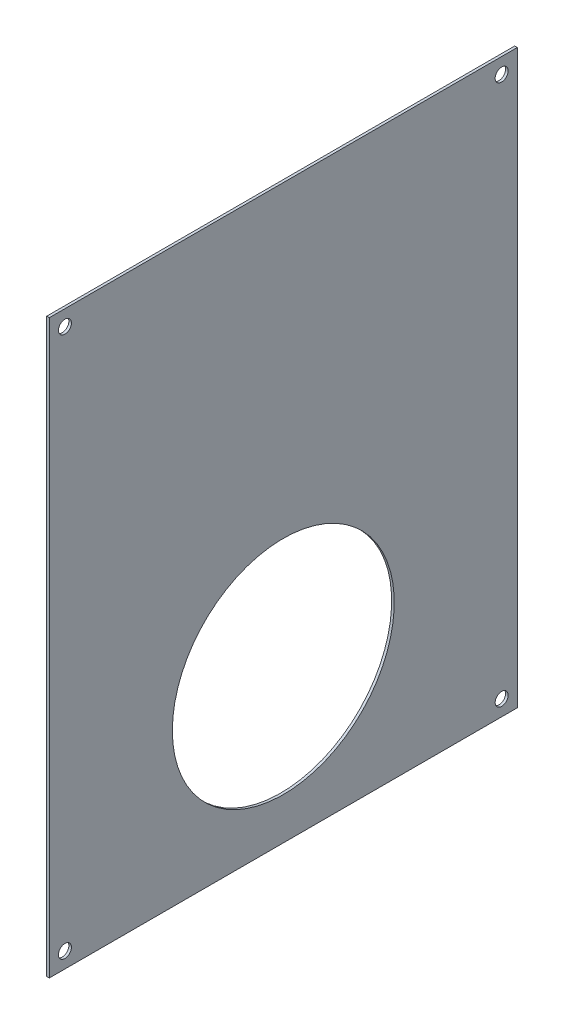
ISO-10303-21;
HEADER;
FILE_DESCRIPTION(('STEP AP214'),'2;1');
FILE_NAME('part.step','',(''),(''),'','','');
FILE_SCHEMA(('AUTOMOTIVE_DESIGN { 1 0 10303 214 1 1 1 1 }'));
ENDSEC;
DATA;
#1=APPLICATION_CONTEXT('core data for automotive mechanical design processes');
#2=APPLICATION_PROTOCOL_DEFINITION('international standard','automotive_design',2000,#1);
#3=PRODUCT_CONTEXT('',#1,'mechanical');
#4=PRODUCT('Part','Part','',(#3));
#5=PRODUCT_RELATED_PRODUCT_CATEGORY('part','',(#4));
#6=PRODUCT_DEFINITION_FORMATION('','',#4);
#7=PRODUCT_DEFINITION_CONTEXT('part definition',#1,'design');
#8=PRODUCT_DEFINITION('design','',#6,#7);
#9=PRODUCT_DEFINITION_SHAPE('','',#8);
#10=(LENGTH_UNIT() NAMED_UNIT(*) SI_UNIT(.MILLI.,.METRE.));
#11=(NAMED_UNIT(*) PLANE_ANGLE_UNIT() SI_UNIT($,.RADIAN.));
#12=(NAMED_UNIT(*) SI_UNIT($,.STERADIAN.) SOLID_ANGLE_UNIT());
#13=UNCERTAINTY_MEASURE_WITH_UNIT(LENGTH_MEASURE(1.E-05),#10,'distance_accuracy_value','');
#14=(GEOMETRIC_REPRESENTATION_CONTEXT(3) GLOBAL_UNCERTAINTY_ASSIGNED_CONTEXT((#13)) GLOBAL_UNIT_ASSIGNED_CONTEXT((#10,
#11,#12)) REPRESENTATION_CONTEXT('',''));
#15=CARTESIAN_POINT('',(0.,0.,0.));
#16=DIRECTION('',(0.,0.,1.));
#17=DIRECTION('',(1.,0.,0.));
#18=AXIS2_PLACEMENT_3D('',#15,#16,#17);
#19=CARTESIAN_POINT('',(0.,0.,0.));
#20=DIRECTION('',(1.,0.,0.));
#21=DIRECTION('',(0.,1.,0.));
#22=AXIS2_PLACEMENT_3D('',#19,#20,#21);
#23=PLANE('',#22);
#24=CARTESIAN_POINT('',(0.,-51.2198971425055,0.));
#25=DIRECTION('',(1.,0.,0.));
#26=DIRECTION('',(0.,0.,-1.));
#27=AXIS2_PLACEMENT_3D('',#24,#25,#26);
#28=CIRCLE('',#27,42.6818250884157);
#29=CARTESIAN_POINT('',(0.,-51.2198971425055,42.6818250884157));
#30=VERTEX_POINT('',#29);
#31=EDGE_CURVE('E124',#30,#30,#28,.T.);
#32=ORIENTED_EDGE('',*,*,#31,.T.);
#33=EDGE_LOOP('',(#32));
#34=FACE_BOUND('',#33,.T.);
#35=CARTESIAN_POINT('',(0.,-104.,84.));
#36=DIRECTION('',(1.,0.,0.));
#37=DIRECTION('',(0.,0.,-1.));
#38=AXIS2_PLACEMENT_3D('',#35,#36,#37);
#39=CIRCLE('',#38,2.5);
#40=CARTESIAN_POINT('',(0.,-104.,86.5));
#41=VERTEX_POINT('',#40);
#42=EDGE_CURVE('E145',#41,#41,#39,.T.);
#43=ORIENTED_EDGE('',*,*,#42,.T.);
#44=EDGE_LOOP('',(#43));
#45=FACE_BOUND('',#44,.T.);
#46=CARTESIAN_POINT('',(0.,104.,-84.));
#47=DIRECTION('',(1.,0.,0.));
#48=DIRECTION('',(0.,0.,-1.));
#49=AXIS2_PLACEMENT_3D('',#46,#47,#48);
#50=CIRCLE('',#49,2.5);
#51=CARTESIAN_POINT('',(0.,104.,-81.5));
#52=VERTEX_POINT('',#51);
#53=EDGE_CURVE('E129',#52,#52,#50,.T.);
#54=ORIENTED_EDGE('',*,*,#53,.T.);
#55=EDGE_LOOP('',(#54));
#56=FACE_BOUND('',#55,.T.);
#57=CARTESIAN_POINT('',(0.,104.,84.));
#58=DIRECTION('',(1.,0.,0.));
#59=DIRECTION('',(0.,0.,-1.));
#60=AXIS2_PLACEMENT_3D('',#57,#58,#59);
#61=CIRCLE('',#60,2.5);
#62=CARTESIAN_POINT('',(0.,104.,86.5));
#63=VERTEX_POINT('',#62);
#64=EDGE_CURVE('E160',#63,#63,#61,.T.);
#65=ORIENTED_EDGE('',*,*,#64,.T.);
#66=EDGE_LOOP('',(#65));
#67=FACE_BOUND('',#66,.T.);
#68=CARTESIAN_POINT('',(0.,-104.,-84.));
#69=DIRECTION('',(1.,0.,0.));
#70=DIRECTION('',(0.,0.,-1.));
#71=AXIS2_PLACEMENT_3D('',#68,#69,#70);
#72=CIRCLE('',#71,2.5);
#73=CARTESIAN_POINT('',(0.,-104.,-81.5));
#74=VERTEX_POINT('',#73);
#75=EDGE_CURVE('E98',#74,#74,#72,.T.);
#76=ORIENTED_EDGE('',*,*,#75,.T.);
#77=EDGE_LOOP('',(#76));
#78=FACE_BOUND('',#77,.T.);
#79=DIRECTION('',(0.,0.,1.));
#80=VECTOR('',#79,1.);
#81=CARTESIAN_POINT('',(0.,110.,-90.));
#82=LINE('',#81,#80);
#83=CARTESIAN_POINT('',(0.,110.,-90.));
#84=VERTEX_POINT('',#83);
#85=CARTESIAN_POINT('',(0.,110.,90.));
#86=VERTEX_POINT('',#85);
#87=EDGE_CURVE('E26',#84,#86,#82,.T.);
#88=ORIENTED_EDGE('',*,*,#87,.F.);
#89=DIRECTION('',(0.,1.,0.));
#90=VECTOR('',#89,1.);
#91=CARTESIAN_POINT('',(0.,-110.,-90.));
#92=LINE('',#91,#90);
#93=CARTESIAN_POINT('',(0.,-110.,-90.));
#94=VERTEX_POINT('',#93);
#95=EDGE_CURVE('E119',#94,#84,#92,.T.);
#96=ORIENTED_EDGE('',*,*,#95,.F.);
#97=DIRECTION('',(0.,0.,-1.));
#98=VECTOR('',#97,1.);
#99=CARTESIAN_POINT('',(0.,-110.,90.));
#100=LINE('',#99,#98);
#101=CARTESIAN_POINT('',(0.,-110.,90.));
#102=VERTEX_POINT('',#101);
#103=EDGE_CURVE('E152',#102,#94,#100,.T.);
#104=ORIENTED_EDGE('',*,*,#103,.F.);
#105=DIRECTION('',(0.,-1.,0.));
#106=VECTOR('',#105,1.);
#107=CARTESIAN_POINT('',(0.,110.,90.));
#108=LINE('',#107,#106);
#109=EDGE_CURVE('E115',#86,#102,#108,.T.);
#110=ORIENTED_EDGE('',*,*,#109,.F.);
#111=EDGE_LOOP('',(#88,#96,#104,#110));
#112=FACE_BOUND('',#111,.T.);
#113=ADVANCED_FACE('F15',(#34,#45,#56,#67,#78,#112),#23,.F.);
#114=CARTESIAN_POINT('',(1.,0.,0.));
#115=DIRECTION('',(1.,0.,0.));
#116=DIRECTION('',(0.,1.,0.));
#117=AXIS2_PLACEMENT_3D('',#114,#115,#116);
#118=PLANE('',#117);
#119=CARTESIAN_POINT('',(1.,-51.2198971425055,0.));
#120=DIRECTION('',(-1.,0.,0.));
#121=DIRECTION('',(0.,0.,-1.));
#122=AXIS2_PLACEMENT_3D('',#119,#120,#121);
#123=CIRCLE('',#122,42.6818250884157);
#124=CARTESIAN_POINT('',(1.,-51.2198971425055,42.6818250884157));
#125=VERTEX_POINT('',#124);
#126=EDGE_CURVE('E148',#125,#125,#123,.T.);
#127=ORIENTED_EDGE('',*,*,#126,.T.);
#128=EDGE_LOOP('',(#127));
#129=FACE_BOUND('',#128,.T.);
#130=CARTESIAN_POINT('',(1.,-104.,84.));
#131=DIRECTION('',(-1.,0.,0.));
#132=DIRECTION('',(0.,0.,-1.));
#133=AXIS2_PLACEMENT_3D('',#130,#131,#132);
#134=CIRCLE('',#133,2.5);
#135=CARTESIAN_POINT('',(1.,-104.,86.5));
#136=VERTEX_POINT('',#135);
#137=EDGE_CURVE('E125',#136,#136,#134,.T.);
#138=ORIENTED_EDGE('',*,*,#137,.T.);
#139=EDGE_LOOP('',(#138));
#140=FACE_BOUND('',#139,.T.);
#141=CARTESIAN_POINT('',(1.,104.,-84.));
#142=DIRECTION('',(-1.,0.,0.));
#143=DIRECTION('',(0.,0.,-1.));
#144=AXIS2_PLACEMENT_3D('',#141,#142,#143);
#145=CIRCLE('',#144,2.5);
#146=CARTESIAN_POINT('',(1.,104.,-81.5));
#147=VERTEX_POINT('',#146);
#148=EDGE_CURVE('E144',#147,#147,#145,.T.);
#149=ORIENTED_EDGE('',*,*,#148,.T.);
#150=EDGE_LOOP('',(#149));
#151=FACE_BOUND('',#150,.T.);
#152=CARTESIAN_POINT('',(1.,104.,84.));
#153=DIRECTION('',(-1.,0.,0.));
#154=DIRECTION('',(0.,0.,-1.));
#155=AXIS2_PLACEMENT_3D('',#152,#153,#154);
#156=CIRCLE('',#155,2.5);
#157=CARTESIAN_POINT('',(1.,104.,86.5));
#158=VERTEX_POINT('',#157);
#159=EDGE_CURVE('E114',#158,#158,#156,.T.);
#160=ORIENTED_EDGE('',*,*,#159,.T.);
#161=EDGE_LOOP('',(#160));
#162=FACE_BOUND('',#161,.T.);
#163=CARTESIAN_POINT('',(1.,-104.,-84.));
#164=DIRECTION('',(-1.,0.,0.));
#165=DIRECTION('',(0.,0.,-1.));
#166=AXIS2_PLACEMENT_3D('',#163,#164,#165);
#167=CIRCLE('',#166,2.5);
#168=CARTESIAN_POINT('',(1.,-104.,-81.5));
#169=VERTEX_POINT('',#168);
#170=EDGE_CURVE('E97',#169,#169,#167,.T.);
#171=ORIENTED_EDGE('',*,*,#170,.T.);
#172=EDGE_LOOP('',(#171));
#173=FACE_BOUND('',#172,.T.);
#174=DIRECTION('',(0.,0.,1.));
#175=VECTOR('',#174,1.);
#176=CARTESIAN_POINT('',(1.,110.,-90.));
#177=LINE('',#176,#175);
#178=CARTESIAN_POINT('',(1.,110.,-90.));
#179=VERTEX_POINT('',#178);
#180=CARTESIAN_POINT('',(1.,110.,90.));
#181=VERTEX_POINT('',#180);
#182=EDGE_CURVE('E9',#179,#181,#177,.T.);
#183=ORIENTED_EDGE('',*,*,#182,.T.);
#184=DIRECTION('',(0.,-1.,0.));
#185=VECTOR('',#184,1.);
#186=CARTESIAN_POINT('',(1.,110.,90.));
#187=LINE('',#186,#185);
#188=CARTESIAN_POINT('',(1.,-110.,90.));
#189=VERTEX_POINT('',#188);
#190=EDGE_CURVE('E118',#181,#189,#187,.T.);
#191=ORIENTED_EDGE('',*,*,#190,.T.);
#192=DIRECTION('',(0.,0.,-1.));
#193=VECTOR('',#192,1.);
#194=CARTESIAN_POINT('',(1.,-110.,90.));
#195=LINE('',#194,#193);
#196=CARTESIAN_POINT('',(1.,-110.,-90.));
#197=VERTEX_POINT('',#196);
#198=EDGE_CURVE('E163',#189,#197,#195,.T.);
#199=ORIENTED_EDGE('',*,*,#198,.T.);
#200=DIRECTION('',(0.,1.,0.));
#201=VECTOR('',#200,1.);
#202=CARTESIAN_POINT('',(1.,-110.,-90.));
#203=LINE('',#202,#201);
#204=EDGE_CURVE('E130',#197,#179,#203,.T.);
#205=ORIENTED_EDGE('',*,*,#204,.T.);
#206=EDGE_LOOP('',(#183,#191,#199,#205));
#207=FACE_BOUND('',#206,.T.);
#208=ADVANCED_FACE('F102',(#129,#140,#151,#162,#173,#207),#118,.T.);
#209=CARTESIAN_POINT('',(0.,110.,-90.));
#210=DIRECTION('',(0.,1.,0.));
#211=DIRECTION('',(1.,0.,0.));
#212=AXIS2_PLACEMENT_3D('',#209,#210,#211);
#213=PLANE('',#212);
#214=ORIENTED_EDGE('',*,*,#87,.T.);
#215=DIRECTION('',(1.,0.,0.));
#216=VECTOR('',#215,1.);
#217=CARTESIAN_POINT('',(0.,110.,90.));
#218=LINE('',#217,#216);
#219=EDGE_CURVE('E155',#86,#181,#218,.T.);
#220=ORIENTED_EDGE('',*,*,#219,.T.);
#221=ORIENTED_EDGE('',*,*,#182,.F.);
#222=DIRECTION('',(1.,0.,0.));
#223=VECTOR('',#222,1.);
#224=CARTESIAN_POINT('',(0.,110.,-90.));
#225=LINE('',#224,#223);
#226=EDGE_CURVE('E123',#84,#179,#225,.T.);
#227=ORIENTED_EDGE('',*,*,#226,.F.);
#228=EDGE_LOOP('',(#214,#220,#221,#227));
#229=FACE_BOUND('',#228,.T.);
#230=ADVANCED_FACE('F198',(#229),#213,.T.);
#231=CARTESIAN_POINT('',(0.,110.,90.));
#232=DIRECTION('',(0.,0.,1.));
#233=DIRECTION('',(1.,0.,0.));
#234=AXIS2_PLACEMENT_3D('',#231,#232,#233);
#235=PLANE('',#234);
#236=ORIENTED_EDGE('',*,*,#109,.T.);
#237=DIRECTION('',(1.,0.,0.));
#238=VECTOR('',#237,1.);
#239=CARTESIAN_POINT('',(0.,-110.,90.));
#240=LINE('',#239,#238);
#241=EDGE_CURVE('E19',#102,#189,#240,.T.);
#242=ORIENTED_EDGE('',*,*,#241,.T.);
#243=ORIENTED_EDGE('',*,*,#190,.F.);
#244=ORIENTED_EDGE('',*,*,#219,.F.);
#245=EDGE_LOOP('',(#236,#242,#243,#244));
#246=FACE_BOUND('',#245,.T.);
#247=ADVANCED_FACE('F204',(#246),#235,.T.);
#248=CARTESIAN_POINT('',(0.,-110.,90.));
#249=DIRECTION('',(0.,-1.,0.));
#250=DIRECTION('',(0.,0.,-1.));
#251=AXIS2_PLACEMENT_3D('',#248,#249,#250);
#252=PLANE('',#251);
#253=ORIENTED_EDGE('',*,*,#103,.T.);
#254=DIRECTION('',(1.,0.,0.));
#255=VECTOR('',#254,1.);
#256=CARTESIAN_POINT('',(0.,-110.,-90.));
#257=LINE('',#256,#255);
#258=EDGE_CURVE('E133',#94,#197,#257,.T.);
#259=ORIENTED_EDGE('',*,*,#258,.T.);
#260=ORIENTED_EDGE('',*,*,#198,.F.);
#261=ORIENTED_EDGE('',*,*,#241,.F.);
#262=EDGE_LOOP('',(#253,#259,#260,#261));
#263=FACE_BOUND('',#262,.T.);
#264=ADVANCED_FACE('F210',(#263),#252,.T.);
#265=CARTESIAN_POINT('',(0.,-110.,-90.));
#266=DIRECTION('',(0.,0.,-1.));
#267=DIRECTION('',(0.,-1.,0.));
#268=AXIS2_PLACEMENT_3D('',#265,#266,#267);
#269=PLANE('',#268);
#270=ORIENTED_EDGE('',*,*,#95,.T.);
#271=ORIENTED_EDGE('',*,*,#226,.T.);
#272=ORIENTED_EDGE('',*,*,#204,.F.);
#273=ORIENTED_EDGE('',*,*,#258,.F.);
#274=EDGE_LOOP('',(#270,#271,#272,#273));
#275=FACE_BOUND('',#274,.T.);
#276=ADVANCED_FACE('F17',(#275),#269,.T.);
#277=CARTESIAN_POINT('',(1.,-51.2198971425055,0.));
#278=DIRECTION('',(-1.,0.,0.));
#279=DIRECTION('',(0.,0.,-1.));
#280=AXIS2_PLACEMENT_3D('',#277,#278,#279);
#281=CYLINDRICAL_SURFACE('',#280,42.6818250884157);
#282=ORIENTED_EDGE('',*,*,#126,.F.);
#283=DIRECTION('',(-1.,0.,0.));
#284=VECTOR('',#283,1.);
#285=CARTESIAN_POINT('',(1.,-51.2198971425055,42.6818250884157));
#286=LINE('',#285,#284);
#287=EDGE_CURVE('E137',#125,#30,#286,.T.);
#288=ORIENTED_EDGE('',*,*,#287,.T.);
#289=ORIENTED_EDGE('',*,*,#31,.F.);
#290=ORIENTED_EDGE('',*,*,#287,.F.);
#291=EDGE_LOOP('',(#282,#288,#289,#290));
#292=FACE_BOUND('',#291,.T.);
#293=ADVANCED_FACE('F236',(#292),#281,.F.);
#294=CARTESIAN_POINT('',(-283.255167059457,-104.,84.));
#295=DIRECTION('',(1.,0.,0.));
#296=DIRECTION('',(0.,0.,-1.));
#297=AXIS2_PLACEMENT_3D('',#294,#295,#296);
#298=CYLINDRICAL_SURFACE('',#297,2.5);
#299=ORIENTED_EDGE('',*,*,#137,.F.);
#300=DIRECTION('',(-1.,0.,0.));
#301=VECTOR('',#300,1.);
#302=CARTESIAN_POINT('',(-283.255167059457,-104.,86.5));
#303=LINE('',#302,#301);
#304=EDGE_CURVE('E110',#136,#41,#303,.T.);
#305=ORIENTED_EDGE('',*,*,#304,.T.);
#306=ORIENTED_EDGE('',*,*,#42,.F.);
#307=ORIENTED_EDGE('',*,*,#304,.F.);
#308=EDGE_LOOP('',(#299,#305,#306,#307));
#309=FACE_BOUND('',#308,.T.);
#310=ADVANCED_FACE('F297',(#309),#298,.F.);
#311=CARTESIAN_POINT('',(-283.255167059457,104.,-84.));
#312=DIRECTION('',(1.,0.,0.));
#313=DIRECTION('',(0.,0.,-1.));
#314=AXIS2_PLACEMENT_3D('',#311,#312,#313);
#315=CYLINDRICAL_SURFACE('',#314,2.5);
#316=ORIENTED_EDGE('',*,*,#148,.F.);
#317=DIRECTION('',(-1.,0.,0.));
#318=VECTOR('',#317,1.);
#319=CARTESIAN_POINT('',(-283.255167059457,104.,-81.5));
#320=LINE('',#319,#318);
#321=EDGE_CURVE('E139',#147,#52,#320,.T.);
#322=ORIENTED_EDGE('',*,*,#321,.T.);
#323=ORIENTED_EDGE('',*,*,#53,.F.);
#324=ORIENTED_EDGE('',*,*,#321,.F.);
#325=EDGE_LOOP('',(#316,#322,#323,#324));
#326=FACE_BOUND('',#325,.T.);
#327=ADVANCED_FACE('F267',(#326),#315,.F.);
#328=CARTESIAN_POINT('',(-283.255167059457,104.,84.));
#329=DIRECTION('',(1.,0.,0.));
#330=DIRECTION('',(0.,0.,-1.));
#331=AXIS2_PLACEMENT_3D('',#328,#329,#330);
#332=CYLINDRICAL_SURFACE('',#331,2.5);
#333=ORIENTED_EDGE('',*,*,#159,.F.);
#334=DIRECTION('',(-1.,0.,0.));
#335=VECTOR('',#334,1.);
#336=CARTESIAN_POINT('',(-283.255167059457,104.,86.5));
#337=LINE('',#336,#335);
#338=EDGE_CURVE('E159',#158,#63,#337,.T.);
#339=ORIENTED_EDGE('',*,*,#338,.T.);
#340=ORIENTED_EDGE('',*,*,#64,.F.);
#341=ORIENTED_EDGE('',*,*,#338,.F.);
#342=EDGE_LOOP('',(#333,#339,#340,#341));
#343=FACE_BOUND('',#342,.T.);
#344=ADVANCED_FACE('F262',(#343),#332,.F.);
#345=CARTESIAN_POINT('',(-283.255167059457,-104.,-84.));
#346=DIRECTION('',(1.,0.,0.));
#347=DIRECTION('',(0.,0.,-1.));
#348=AXIS2_PLACEMENT_3D('',#345,#346,#347);
#349=CYLINDRICAL_SURFACE('',#348,2.5);
#350=ORIENTED_EDGE('',*,*,#170,.F.);
#351=DIRECTION('',(-1.,0.,0.));
#352=VECTOR('',#351,1.);
#353=CARTESIAN_POINT('',(-283.255167059457,-104.,-81.5));
#354=LINE('',#353,#352);
#355=EDGE_CURVE('E94',#169,#74,#354,.T.);
#356=ORIENTED_EDGE('',*,*,#355,.T.);
#357=ORIENTED_EDGE('',*,*,#75,.F.);
#358=ORIENTED_EDGE('',*,*,#355,.F.);
#359=EDGE_LOOP('',(#350,#356,#357,#358));
#360=FACE_BOUND('',#359,.T.);
#361=ADVANCED_FACE('F96',(#360),#349,.F.);
#362=CLOSED_SHELL('',(#113,#208,#230,#247,#264,#276,#293,#310,#327,#344,#361));
#363=MANIFOLD_SOLID_BREP('B1',#362);
#364=ADVANCED_BREP_SHAPE_REPRESENTATION('',(#18,#363),#14);
#365=SHAPE_DEFINITION_REPRESENTATION(#9,#364);
ENDSEC;
END-ISO-10303-21;
